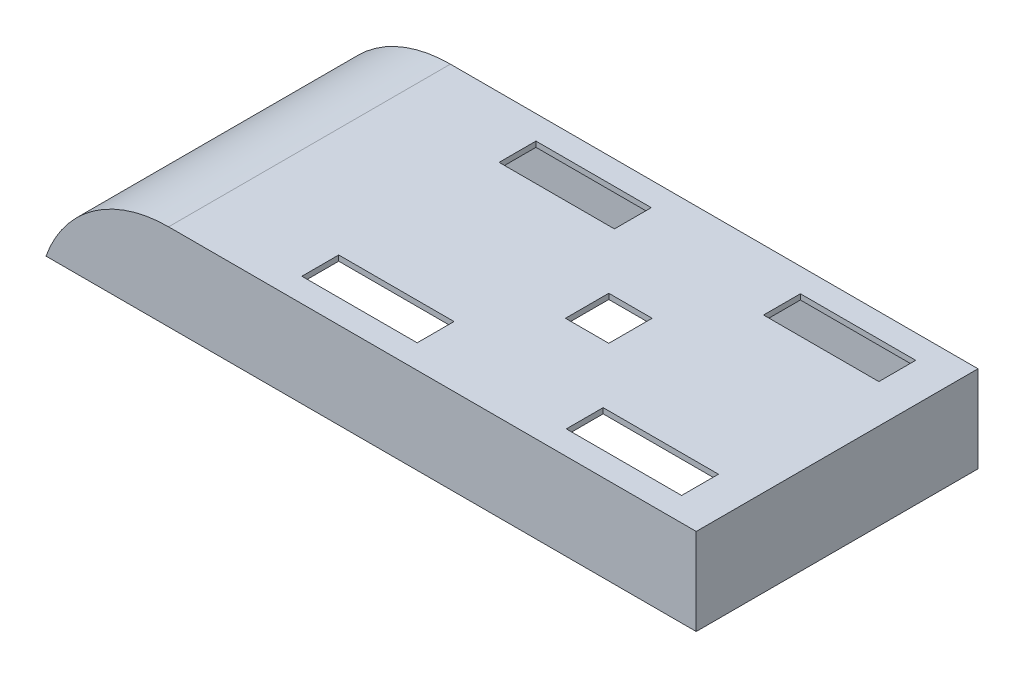
ISO-10303-21;
HEADER;
FILE_DESCRIPTION(('STEP AP214'),'2;1');
FILE_NAME('part.step','',(''),(''),'','','');
FILE_SCHEMA(('AUTOMOTIVE_DESIGN { 1 0 10303 214 1 1 1 1 }'));
ENDSEC;
DATA;
#1=APPLICATION_CONTEXT('core data for automotive mechanical design processes');
#2=APPLICATION_PROTOCOL_DEFINITION('international standard','automotive_design',2000,#1);
#3=PRODUCT_CONTEXT('',#1,'mechanical');
#4=PRODUCT('Part','Part','',(#3));
#5=PRODUCT_RELATED_PRODUCT_CATEGORY('part','',(#4));
#6=PRODUCT_DEFINITION_FORMATION('','',#4);
#7=PRODUCT_DEFINITION_CONTEXT('part definition',#1,'design');
#8=PRODUCT_DEFINITION('design','',#6,#7);
#9=PRODUCT_DEFINITION_SHAPE('','',#8);
#10=(LENGTH_UNIT() NAMED_UNIT(*) SI_UNIT(.MILLI.,.METRE.));
#11=(NAMED_UNIT(*) PLANE_ANGLE_UNIT() SI_UNIT($,.RADIAN.));
#12=(NAMED_UNIT(*) SI_UNIT($,.STERADIAN.) SOLID_ANGLE_UNIT());
#13=UNCERTAINTY_MEASURE_WITH_UNIT(LENGTH_MEASURE(1.E-05),#10,'distance_accuracy_value','');
#14=(GEOMETRIC_REPRESENTATION_CONTEXT(3) GLOBAL_UNCERTAINTY_ASSIGNED_CONTEXT((#13)) GLOBAL_UNIT_ASSIGNED_CONTEXT((#10,
#11,#12)) REPRESENTATION_CONTEXT('',''));
#15=CARTESIAN_POINT('',(0.,0.,0.));
#16=DIRECTION('',(0.,0.,1.));
#17=DIRECTION('',(1.,0.,0.));
#18=AXIS2_PLACEMENT_3D('',#15,#16,#17);
#19=CARTESIAN_POINT('',(0.,0.,0.));
#20=DIRECTION('',(0.,-1.,0.));
#21=DIRECTION('',(0.,0.,-1.));
#22=AXIS2_PLACEMENT_3D('',#19,#20,#21);
#23=PLANE('',#22);
#24=DIRECTION('',(0.,0.,1.));
#25=VECTOR('',#24,1.);
#26=CARTESIAN_POINT('',(0.,0.,0.));
#27=LINE('',#26,#25);
#28=CARTESIAN_POINT('',(0.,0.,-330.2));
#29=VERTEX_POINT('',#28);
#30=CARTESIAN_POINT('',(0.,0.,0.));
#31=VERTEX_POINT('',#30);
#32=EDGE_CURVE('E355',#29,#31,#27,.T.);
#33=ORIENTED_EDGE('',*,*,#32,.F.);
#34=DIRECTION('',(-1.,0.,0.));
#35=VECTOR('',#34,1.);
#36=CARTESIAN_POINT('',(0.,0.,-330.2));
#37=LINE('',#36,#35);
#38=CARTESIAN_POINT('',(762.,0.,-330.2));
#39=VERTEX_POINT('',#38);
#40=EDGE_CURVE('E373',#39,#29,#37,.T.);
#41=ORIENTED_EDGE('',*,*,#40,.F.);
#42=DIRECTION('',(0.,0.,-1.));
#43=VECTOR('',#42,1.);
#44=CARTESIAN_POINT('',(762.,0.,0.));
#45=LINE('',#44,#43);
#46=CARTESIAN_POINT('',(762.,0.,0.));
#47=VERTEX_POINT('',#46);
#48=EDGE_CURVE('E383',#47,#39,#45,.T.);
#49=ORIENTED_EDGE('',*,*,#48,.F.);
#50=DIRECTION('',(1.,0.,0.));
#51=VECTOR('',#50,1.);
#52=CARTESIAN_POINT('',(0.,0.,0.));
#53=LINE('',#52,#51);
#54=EDGE_CURVE('E381',#31,#47,#53,.T.);
#55=ORIENTED_EDGE('',*,*,#54,.F.);
#56=EDGE_LOOP('',(#33,#41,#49,#55));
#57=FACE_BOUND('',#56,.T.);
#58=DIRECTION('',(-1.,0.,0.));
#59=VECTOR('',#58,1.);
#60=CARTESIAN_POINT('',(0.,0.,-323.85));
#61=LINE('',#60,#59);
#62=CARTESIAN_POINT('',(755.65,0.,-323.85));
#63=VERTEX_POINT('',#62);
#64=CARTESIAN_POINT('',(6.75359549152275,0.,-323.85));
#65=VERTEX_POINT('',#64);
#66=EDGE_CURVE('E342',#63,#65,#61,.T.);
#67=ORIENTED_EDGE('',*,*,#66,.T.);
#68=DIRECTION('',(0.,0.,-1.));
#69=VECTOR('',#68,1.);
#70=CARTESIAN_POINT('',(6.75359549152275,0.,-323.85));
#71=LINE('',#70,#69);
#72=CARTESIAN_POINT('',(6.75359549152275,0.,-6.35));
#73=VERTEX_POINT('',#72);
#74=EDGE_CURVE('E332',#65,#73,#71,.F.);
#75=ORIENTED_EDGE('',*,*,#74,.T.);
#76=DIRECTION('',(1.,0.,0.));
#77=VECTOR('',#76,1.);
#78=CARTESIAN_POINT('',(0.,0.,-6.35));
#79=LINE('',#78,#77);
#80=CARTESIAN_POINT('',(755.65,0.,-6.35));
#81=VERTEX_POINT('',#80);
#82=EDGE_CURVE('E360',#73,#81,#79,.T.);
#83=ORIENTED_EDGE('',*,*,#82,.T.);
#84=DIRECTION('',(0.,0.,-1.));
#85=VECTOR('',#84,1.);
#86=CARTESIAN_POINT('',(755.65,0.,0.));
#87=LINE('',#86,#85);
#88=EDGE_CURVE('E363',#81,#63,#87,.T.);
#89=ORIENTED_EDGE('',*,*,#88,.T.);
#90=EDGE_LOOP('',(#67,#75,#83,#89));
#91=FACE_BOUND('',#90,.T.);
#92=ADVANCED_FACE('F45',(#57,#91),#23,.T.);
#93=CARTESIAN_POINT('',(0.,101.6,0.));
#94=DIRECTION('',(0.,0.,-1.));
#95=DIRECTION('',(-1.,0.,0.));
#96=AXIS2_PLACEMENT_3D('',#93,#94,#95);
#97=PLANE('',#96);
#98=DIRECTION('',(1.,0.,0.));
#99=VECTOR('',#98,1.);
#100=CARTESIAN_POINT('',(0.,101.6,0.));
#101=LINE('',#100,#99);
#102=CARTESIAN_POINT('',(143.684097937106,101.6,0.));
#103=VERTEX_POINT('',#102);
#104=CARTESIAN_POINT('',(762.,101.6,0.));
#105=VERTEX_POINT('',#104);
#106=EDGE_CURVE('E370',#103,#105,#101,.T.);
#107=ORIENTED_EDGE('',*,*,#106,.F.);
#108=CARTESIAN_POINT('',(143.684097937106,-50.7999999999999,0.));
#109=DIRECTION('',(0.,0.,-1.));
#110=DIRECTION('',(-1.,0.,0.));
#111=AXIS2_PLACEMENT_3D('',#108,#109,#110);
#112=CIRCLE('',#111,152.4);
#113=EDGE_CURVE('E394',#103,#31,#112,.F.);
#114=ORIENTED_EDGE('',*,*,#113,.T.);
#115=ORIENTED_EDGE('',*,*,#54,.T.);
#116=DIRECTION('',(0.,-1.,0.));
#117=VECTOR('',#116,1.);
#118=CARTESIAN_POINT('',(762.,101.6,0.));
#119=LINE('',#118,#117);
#120=EDGE_CURVE('E388',#105,#47,#119,.T.);
#121=ORIENTED_EDGE('',*,*,#120,.F.);
#122=EDGE_LOOP('',(#107,#114,#115,#121));
#123=FACE_BOUND('',#122,.T.);
#124=ADVANCED_FACE('F495',(#123),#97,.F.);
#125=CARTESIAN_POINT('',(762.,101.6,0.));
#126=DIRECTION('',(-1.,0.,0.));
#127=DIRECTION('',(0.,0.,1.));
#128=AXIS2_PLACEMENT_3D('',#125,#126,#127);
#129=PLANE('',#128);
#130=ORIENTED_EDGE('',*,*,#48,.T.);
#131=DIRECTION('',(0.,-1.,0.));
#132=VECTOR('',#131,1.);
#133=CARTESIAN_POINT('',(762.,101.6,-330.2));
#134=LINE('',#133,#132);
#135=CARTESIAN_POINT('',(762.,101.6,-330.2));
#136=VERTEX_POINT('',#135);
#137=EDGE_CURVE('E378',#136,#39,#134,.T.);
#138=ORIENTED_EDGE('',*,*,#137,.F.);
#139=DIRECTION('',(0.,0.,-1.));
#140=VECTOR('',#139,1.);
#141=CARTESIAN_POINT('',(762.,101.6,0.));
#142=LINE('',#141,#140);
#143=EDGE_CURVE('E372',#105,#136,#142,.T.);
#144=ORIENTED_EDGE('',*,*,#143,.F.);
#145=ORIENTED_EDGE('',*,*,#120,.T.);
#146=EDGE_LOOP('',(#130,#138,#144,#145));
#147=FACE_BOUND('',#146,.T.);
#148=ADVANCED_FACE('F503',(#147),#129,.F.);
#149=CARTESIAN_POINT('',(0.,101.6,-330.2));
#150=DIRECTION('',(0.,0.,1.));
#151=DIRECTION('',(1.,0.,0.));
#152=AXIS2_PLACEMENT_3D('',#149,#150,#151);
#153=PLANE('',#152);
#154=ORIENTED_EDGE('',*,*,#40,.T.);
#155=CARTESIAN_POINT('',(143.684097937106,-50.7999999999999,-330.2));
#156=DIRECTION('',(0.,0.,1.));
#157=DIRECTION('',(1.,0.,0.));
#158=AXIS2_PLACEMENT_3D('',#155,#156,#157);
#159=CIRCLE('',#158,152.4);
#160=CARTESIAN_POINT('',(143.684097937106,101.6,-330.2));
#161=VERTEX_POINT('',#160);
#162=EDGE_CURVE('E396',#29,#161,#159,.F.);
#163=ORIENTED_EDGE('',*,*,#162,.T.);
#164=DIRECTION('',(-1.,0.,0.));
#165=VECTOR('',#164,1.);
#166=CARTESIAN_POINT('',(0.,101.6,-330.2));
#167=LINE('',#166,#165);
#168=EDGE_CURVE('E375',#136,#161,#167,.T.);
#169=ORIENTED_EDGE('',*,*,#168,.F.);
#170=ORIENTED_EDGE('',*,*,#137,.T.);
#171=EDGE_LOOP('',(#154,#163,#169,#170));
#172=FACE_BOUND('',#171,.T.);
#173=ADVANCED_FACE('F459',(#172),#153,.F.);
#174=CARTESIAN_POINT('',(0.,101.6,0.));
#175=DIRECTION('',(0.,-1.,0.));
#176=DIRECTION('',(0.,0.,-1.));
#177=AXIS2_PLACEMENT_3D('',#174,#175,#176);
#178=PLANE('',#177);
#179=DIRECTION('',(0.,0.,-1.));
#180=VECTOR('',#179,1.);
#181=CARTESIAN_POINT('',(716.929069023888,101.6,-27.9349999999999));
#182=LINE('',#181,#180);
#183=CARTESIAN_POINT('',(716.929069023888,101.6,-27.9349999999999));
#184=VERTEX_POINT('',#183);
#185=CARTESIAN_POINT('',(716.929069023888,101.6,-71.1150000000001));
#186=VERTEX_POINT('',#185);
#187=EDGE_CURVE('E317',#184,#186,#182,.T.);
#188=ORIENTED_EDGE('',*,*,#187,.F.);
#189=DIRECTION('',(1.,0.,0.));
#190=VECTOR('',#189,1.);
#191=CARTESIAN_POINT('',(716.929069023888,101.6,-27.9349999999999));
#192=LINE('',#191,#190);
#193=CARTESIAN_POINT('',(581.801069023888,101.6,-27.9349999999998));
#194=VERTEX_POINT('',#193);
#195=EDGE_CURVE('E60',#194,#184,#192,.T.);
#196=ORIENTED_EDGE('',*,*,#195,.F.);
#197=DIRECTION('',(0.,0.,1.));
#198=VECTOR('',#197,1.);
#199=CARTESIAN_POINT('',(581.801069023888,101.6,-27.9349999999998));
#200=LINE('',#199,#198);
#201=CARTESIAN_POINT('',(581.801069023888,101.6,-71.1150000000002));
#202=VERTEX_POINT('',#201);
#203=EDGE_CURVE('E305',#202,#194,#200,.T.);
#204=ORIENTED_EDGE('',*,*,#203,.F.);
#205=DIRECTION('',(-1.,0.,0.));
#206=VECTOR('',#205,1.);
#207=CARTESIAN_POINT('',(716.929069023888,101.6,-71.1150000000001));
#208=LINE('',#207,#206);
#209=EDGE_CURVE('E314',#186,#202,#208,.T.);
#210=ORIENTED_EDGE('',*,*,#209,.F.);
#211=EDGE_LOOP('',(#188,#196,#204,#210));
#212=FACE_BOUND('',#211,.T.);
#213=DIRECTION('',(-1.,0.,0.));
#214=VECTOR('',#213,1.);
#215=CARTESIAN_POINT('',(716.929069023888,101.6,-302.265));
#216=LINE('',#215,#214);
#217=CARTESIAN_POINT('',(716.929069023888,101.6,-302.265));
#218=VERTEX_POINT('',#217);
#219=CARTESIAN_POINT('',(581.801069023888,101.6,-302.265));
#220=VERTEX_POINT('',#219);
#221=EDGE_CURVE('E299',#218,#220,#216,.T.);
#222=ORIENTED_EDGE('',*,*,#221,.F.);
#223=DIRECTION('',(0.,0.,-1.));
#224=VECTOR('',#223,1.);
#225=CARTESIAN_POINT('',(716.929069023888,101.6,-302.265));
#226=LINE('',#225,#224);
#227=CARTESIAN_POINT('',(716.929069023888,101.6,-259.085));
#228=VERTEX_POINT('',#227);
#229=EDGE_CURVE('E68',#228,#218,#226,.T.);
#230=ORIENTED_EDGE('',*,*,#229,.F.);
#231=DIRECTION('',(1.,0.,0.));
#232=VECTOR('',#231,1.);
#233=CARTESIAN_POINT('',(716.929069023888,101.6,-259.085));
#234=LINE('',#233,#232);
#235=CARTESIAN_POINT('',(581.801069023888,101.6,-259.085));
#236=VERTEX_POINT('',#235);
#237=EDGE_CURVE('E287',#236,#228,#234,.T.);
#238=ORIENTED_EDGE('',*,*,#237,.F.);
#239=DIRECTION('',(0.,0.,1.));
#240=VECTOR('',#239,1.);
#241=CARTESIAN_POINT('',(581.801069023888,101.6,-302.265));
#242=LINE('',#241,#240);
#243=EDGE_CURVE('E296',#220,#236,#242,.T.);
#244=ORIENTED_EDGE('',*,*,#243,.F.);
#245=EDGE_LOOP('',(#222,#230,#238,#244));
#246=FACE_BOUND('',#245,.T.);
#247=DIRECTION('',(-1.,0.,0.));
#248=VECTOR('',#247,1.);
#249=CARTESIAN_POINT('',(469.025069023888,101.6,-190.5));
#250=LINE('',#249,#248);
#251=CARTESIAN_POINT('',(519.825069023888,101.6,-190.5));
#252=VERTEX_POINT('',#251);
#253=CARTESIAN_POINT('',(469.025069023888,101.6,-190.5));
#254=VERTEX_POINT('',#253);
#255=EDGE_CURVE('E281',#252,#254,#250,.T.);
#256=ORIENTED_EDGE('',*,*,#255,.F.);
#257=DIRECTION('',(0.,0.,-1.));
#258=VECTOR('',#257,1.);
#259=CARTESIAN_POINT('',(519.825069023888,101.6,-139.7));
#260=LINE('',#259,#258);
#261=CARTESIAN_POINT('',(519.825069023888,101.6,-139.7));
#262=VERTEX_POINT('',#261);
#263=EDGE_CURVE('E242',#262,#252,#260,.T.);
#264=ORIENTED_EDGE('',*,*,#263,.F.);
#265=DIRECTION('',(1.,0.,0.));
#266=VECTOR('',#265,1.);
#267=CARTESIAN_POINT('',(469.025069023888,101.6,-139.7));
#268=LINE('',#267,#266);
#269=CARTESIAN_POINT('',(469.025069023888,101.6,-139.7));
#270=VERTEX_POINT('',#269);
#271=EDGE_CURVE('E269',#270,#262,#268,.T.);
#272=ORIENTED_EDGE('',*,*,#271,.F.);
#273=DIRECTION('',(0.,0.,1.));
#274=VECTOR('',#273,1.);
#275=CARTESIAN_POINT('',(469.025069023888,101.6,-139.7));
#276=LINE('',#275,#274);
#277=EDGE_CURVE('E278',#254,#270,#276,.T.);
#278=ORIENTED_EDGE('',*,*,#277,.F.);
#279=EDGE_LOOP('',(#256,#264,#272,#278));
#280=FACE_BOUND('',#279,.T.);
#281=DIRECTION('',(0.,0.,1.));
#282=VECTOR('',#281,1.);
#283=CARTESIAN_POINT('',(271.921069023888,101.6,-302.265));
#284=LINE('',#283,#282);
#285=CARTESIAN_POINT('',(271.921069023888,101.6,-302.265));
#286=VERTEX_POINT('',#285);
#287=CARTESIAN_POINT('',(271.921069023888,101.6,-259.085));
#288=VERTEX_POINT('',#287);
#289=EDGE_CURVE('E258',#286,#288,#284,.T.);
#290=ORIENTED_EDGE('',*,*,#289,.F.);
#291=DIRECTION('',(-1.,0.,0.));
#292=VECTOR('',#291,1.);
#293=CARTESIAN_POINT('',(271.921069023888,101.6,-302.265));
#294=LINE('',#293,#292);
#295=CARTESIAN_POINT('',(407.049069023888,101.6,-302.265));
#296=VERTEX_POINT('',#295);
#297=EDGE_CURVE('E235',#296,#286,#294,.T.);
#298=ORIENTED_EDGE('',*,*,#297,.F.);
#299=DIRECTION('',(0.,0.,-1.));
#300=VECTOR('',#299,1.);
#301=CARTESIAN_POINT('',(407.049069023888,101.6,-302.265));
#302=LINE('',#301,#300);
#303=CARTESIAN_POINT('',(407.049069023888,101.6,-259.085));
#304=VERTEX_POINT('',#303);
#305=EDGE_CURVE('E245',#304,#296,#302,.T.);
#306=ORIENTED_EDGE('',*,*,#305,.F.);
#307=DIRECTION('',(1.,0.,0.));
#308=VECTOR('',#307,1.);
#309=CARTESIAN_POINT('',(271.921069023888,101.6,-259.085));
#310=LINE('',#309,#308);
#311=EDGE_CURVE('E251',#288,#304,#310,.T.);
#312=ORIENTED_EDGE('',*,*,#311,.F.);
#313=EDGE_LOOP('',(#290,#298,#306,#312));
#314=FACE_BOUND('',#313,.T.);
#315=DIRECTION('',(1.,0.,0.));
#316=VECTOR('',#315,1.);
#317=CARTESIAN_POINT('',(271.921069023888,101.6,-27.9349999999999));
#318=LINE('',#317,#316);
#319=CARTESIAN_POINT('',(271.921069023888,101.6,-27.9349999999999));
#320=VERTEX_POINT('',#319);
#321=CARTESIAN_POINT('',(407.049069023888,101.6,-27.9349999999998));
#322=VERTEX_POINT('',#321);
#323=EDGE_CURVE('E261',#320,#322,#318,.T.);
#324=ORIENTED_EDGE('',*,*,#323,.F.);
#325=DIRECTION('',(0.,0.,1.));
#326=VECTOR('',#325,1.);
#327=CARTESIAN_POINT('',(271.921069023888,101.6,-27.9349999999999));
#328=LINE('',#327,#326);
#329=CARTESIAN_POINT('',(271.921069023888,101.6,-71.115));
#330=VERTEX_POINT('',#329);
#331=EDGE_CURVE('E259',#330,#320,#328,.T.);
#332=ORIENTED_EDGE('',*,*,#331,.F.);
#333=DIRECTION('',(-1.,0.,0.));
#334=VECTOR('',#333,1.);
#335=CARTESIAN_POINT('',(271.921069023888,101.6,-71.115));
#336=LINE('',#335,#334);
#337=CARTESIAN_POINT('',(407.049069023888,101.6,-71.1150000000001));
#338=VERTEX_POINT('',#337);
#339=EDGE_CURVE('E326',#338,#330,#336,.T.);
#340=ORIENTED_EDGE('',*,*,#339,.F.);
#341=DIRECTION('',(0.,0.,-1.));
#342=VECTOR('',#341,1.);
#343=CARTESIAN_POINT('',(407.049069023888,101.6,-27.9349999999998));
#344=LINE('',#343,#342);
#345=EDGE_CURVE('E323',#322,#338,#344,.T.);
#346=ORIENTED_EDGE('',*,*,#345,.F.);
#347=EDGE_LOOP('',(#324,#332,#340,#346));
#348=FACE_BOUND('',#347,.T.);
#349=ORIENTED_EDGE('',*,*,#168,.T.);
#350=DIRECTION('',(0.,0.,-1.));
#351=VECTOR('',#350,1.);
#352=CARTESIAN_POINT('',(143.684097937106,101.6,0.));
#353=LINE('',#352,#351);
#354=EDGE_CURVE('E391',#161,#103,#353,.F.);
#355=ORIENTED_EDGE('',*,*,#354,.T.);
#356=ORIENTED_EDGE('',*,*,#106,.T.);
#357=ORIENTED_EDGE('',*,*,#143,.T.);
#358=EDGE_LOOP('',(#349,#355,#356,#357));
#359=FACE_BOUND('',#358,.T.);
#360=ADVANCED_FACE('F255',(#212,#246,#280,#314,#348,#359),#178,.F.);
#361=CARTESIAN_POINT('',(143.684097937106,-50.7999999999999,0.));
#362=DIRECTION('',(0.,0.,-1.));
#363=DIRECTION('',(-1.,0.,0.));
#364=AXIS2_PLACEMENT_3D('',#361,#362,#363);
#365=CYLINDRICAL_SURFACE('',#364,152.4);
#366=ORIENTED_EDGE('',*,*,#162,.F.);
#367=ORIENTED_EDGE('',*,*,#32,.T.);
#368=ORIENTED_EDGE('',*,*,#113,.F.);
#369=ORIENTED_EDGE('',*,*,#354,.F.);
#370=EDGE_LOOP('',(#366,#367,#368,#369));
#371=FACE_BOUND('',#370,.T.);
#372=ADVANCED_FACE('F47',(#371),#365,.T.);
#373=CARTESIAN_POINT('',(0.,101.6,-6.35));
#374=DIRECTION('',(0.,0.,-1.));
#375=DIRECTION('',(-1.,0.,0.));
#376=AXIS2_PLACEMENT_3D('',#373,#374,#375);
#377=PLANE('',#376);
#378=DIRECTION('',(1.,0.,0.));
#379=VECTOR('',#378,1.);
#380=CARTESIAN_POINT('',(0.,95.25,-6.35));
#381=LINE('',#380,#379);
#382=CARTESIAN_POINT('',(143.684097937106,95.25,-6.35));
#383=VERTEX_POINT('',#382);
#384=CARTESIAN_POINT('',(755.65,95.25,-6.35));
#385=VERTEX_POINT('',#384);
#386=EDGE_CURVE('E339',#383,#385,#381,.T.);
#387=ORIENTED_EDGE('',*,*,#386,.T.);
#388=DIRECTION('',(0.,-1.,0.));
#389=VECTOR('',#388,1.);
#390=CARTESIAN_POINT('',(755.65,101.6,-6.35));
#391=LINE('',#390,#389);
#392=EDGE_CURVE('E347',#385,#81,#391,.T.);
#393=ORIENTED_EDGE('',*,*,#392,.T.);
#394=ORIENTED_EDGE('',*,*,#82,.F.);
#395=CARTESIAN_POINT('',(143.684097937106,-50.7999999999999,-6.35));
#396=DIRECTION('',(0.,0.,-1.));
#397=DIRECTION('',(-1.,0.,0.));
#398=AXIS2_PLACEMENT_3D('',#395,#396,#397);
#399=CIRCLE('',#398,146.05);
#400=EDGE_CURVE('E343',#383,#73,#399,.F.);
#401=ORIENTED_EDGE('',*,*,#400,.F.);
#402=EDGE_LOOP('',(#387,#393,#394,#401));
#403=FACE_BOUND('',#402,.T.);
#404=ADVANCED_FACE('F529',(#403),#377,.T.);
#405=CARTESIAN_POINT('',(755.65,101.6,0.));
#406=DIRECTION('',(-1.,0.,0.));
#407=DIRECTION('',(0.,0.,1.));
#408=AXIS2_PLACEMENT_3D('',#405,#406,#407);
#409=PLANE('',#408);
#410=ORIENTED_EDGE('',*,*,#88,.F.);
#411=ORIENTED_EDGE('',*,*,#392,.F.);
#412=DIRECTION('',(0.,0.,-1.));
#413=VECTOR('',#412,1.);
#414=CARTESIAN_POINT('',(755.65,95.25,0.));
#415=LINE('',#414,#413);
#416=CARTESIAN_POINT('',(755.65,95.25,-323.85));
#417=VERTEX_POINT('',#416);
#418=EDGE_CURVE('E341',#385,#417,#415,.T.);
#419=ORIENTED_EDGE('',*,*,#418,.T.);
#420=DIRECTION('',(0.,-1.,0.));
#421=VECTOR('',#420,1.);
#422=CARTESIAN_POINT('',(755.65,101.6,-323.85));
#423=LINE('',#422,#421);
#424=EDGE_CURVE('E350',#417,#63,#423,.T.);
#425=ORIENTED_EDGE('',*,*,#424,.T.);
#426=EDGE_LOOP('',(#410,#411,#419,#425));
#427=FACE_BOUND('',#426,.T.);
#428=ADVANCED_FACE('F533',(#427),#409,.T.);
#429=CARTESIAN_POINT('',(0.,101.6,-323.85));
#430=DIRECTION('',(0.,0.,1.));
#431=DIRECTION('',(1.,0.,0.));
#432=AXIS2_PLACEMENT_3D('',#429,#430,#431);
#433=PLANE('',#432);
#434=ORIENTED_EDGE('',*,*,#66,.F.);
#435=ORIENTED_EDGE('',*,*,#424,.F.);
#436=DIRECTION('',(-1.,0.,0.));
#437=VECTOR('',#436,1.);
#438=CARTESIAN_POINT('',(0.,95.25,-323.85));
#439=LINE('',#438,#437);
#440=CARTESIAN_POINT('',(143.684097937106,95.25,-323.85));
#441=VERTEX_POINT('',#440);
#442=EDGE_CURVE('E352',#417,#441,#439,.T.);
#443=ORIENTED_EDGE('',*,*,#442,.T.);
#444=CARTESIAN_POINT('',(143.684097937106,-50.7999999999999,-323.85));
#445=DIRECTION('',(0.,0.,1.));
#446=DIRECTION('',(1.,0.,0.));
#447=AXIS2_PLACEMENT_3D('',#444,#445,#446);
#448=CIRCLE('',#447,146.05);
#449=EDGE_CURVE('E345',#65,#441,#448,.F.);
#450=ORIENTED_EDGE('',*,*,#449,.F.);
#451=EDGE_LOOP('',(#434,#435,#443,#450));
#452=FACE_BOUND('',#451,.T.);
#453=ADVANCED_FACE('F539',(#452),#433,.T.);
#454=CARTESIAN_POINT('',(0.,95.25,0.));
#455=DIRECTION('',(0.,-1.,0.));
#456=DIRECTION('',(0.,0.,-1.));
#457=AXIS2_PLACEMENT_3D('',#454,#455,#456);
#458=PLANE('',#457);
#459=DIRECTION('',(-1.,0.,0.));
#460=VECTOR('',#459,1.);
#461=CARTESIAN_POINT('',(0.,95.25,-27.9349999999997));
#462=LINE('',#461,#460);
#463=CARTESIAN_POINT('',(716.929069023888,95.25,-27.9349999999999));
#464=VERTEX_POINT('',#463);
#465=CARTESIAN_POINT('',(581.801069023888,95.25,-27.9349999999998));
#466=VERTEX_POINT('',#465);
#467=EDGE_CURVE('E11',#464,#466,#462,.T.);
#468=ORIENTED_EDGE('',*,*,#467,.F.);
#469=DIRECTION('',(0.,0.,1.));
#470=VECTOR('',#469,1.);
#471=CARTESIAN_POINT('',(716.929069023888,95.25,-1.84333293064705E-12));
#472=LINE('',#471,#470);
#473=CARTESIAN_POINT('',(716.929069023888,95.25,-71.1150000000001));
#474=VERTEX_POINT('',#473);
#475=EDGE_CURVE('E433',#474,#464,#472,.T.);
#476=ORIENTED_EDGE('',*,*,#475,.F.);
#477=DIRECTION('',(1.,0.,0.));
#478=VECTOR('',#477,1.);
#479=CARTESIAN_POINT('',(0.,95.25,-71.1150000000004));
#480=LINE('',#479,#478);
#481=CARTESIAN_POINT('',(581.801069023888,95.25,-71.1150000000002));
#482=VERTEX_POINT('',#481);
#483=EDGE_CURVE('E435',#482,#474,#480,.T.);
#484=ORIENTED_EDGE('',*,*,#483,.F.);
#485=DIRECTION('',(0.,0.,-1.));
#486=VECTOR('',#485,1.);
#487=CARTESIAN_POINT('',(581.801069023888,95.25,0.));
#488=LINE('',#487,#486);
#489=EDGE_CURVE('E53',#466,#482,#488,.T.);
#490=ORIENTED_EDGE('',*,*,#489,.F.);
#491=EDGE_LOOP('',(#468,#476,#484,#490));
#492=FACE_BOUND('',#491,.T.);
#493=DIRECTION('',(0.,0.,1.));
#494=VECTOR('',#493,1.);
#495=CARTESIAN_POINT('',(716.929069023887,95.25,1.84333293064704E-12));
#496=LINE('',#495,#494);
#497=CARTESIAN_POINT('',(716.929069023888,95.25,-302.265));
#498=VERTEX_POINT('',#497);
#499=CARTESIAN_POINT('',(716.929069023888,95.25,-259.085));
#500=VERTEX_POINT('',#499);
#501=EDGE_CURVE('E431',#498,#500,#496,.T.);
#502=ORIENTED_EDGE('',*,*,#501,.F.);
#503=DIRECTION('',(1.,0.,0.));
#504=VECTOR('',#503,1.);
#505=CARTESIAN_POINT('',(-1.24171734406756E-13,95.25,-302.265));
#506=LINE('',#505,#504);
#507=CARTESIAN_POINT('',(581.801069023888,95.25,-302.265));
#508=VERTEX_POINT('',#507);
#509=EDGE_CURVE('E424',#508,#498,#506,.T.);
#510=ORIENTED_EDGE('',*,*,#509,.F.);
#511=DIRECTION('',(0.,0.,-1.));
#512=VECTOR('',#511,1.);
#513=CARTESIAN_POINT('',(581.801069023889,95.25,-1.49589843117612E-12));
#514=LINE('',#513,#512);
#515=CARTESIAN_POINT('',(581.801069023888,95.25,-259.085));
#516=VERTEX_POINT('',#515);
#517=EDGE_CURVE('E426',#516,#508,#514,.T.);
#518=ORIENTED_EDGE('',*,*,#517,.F.);
#519=DIRECTION('',(-1.,0.,0.));
#520=VECTOR('',#519,1.);
#521=CARTESIAN_POINT('',(-1.06433208637369E-13,95.25,-259.085));
#522=LINE('',#521,#520);
#523=EDGE_CURVE('E429',#500,#516,#522,.T.);
#524=ORIENTED_EDGE('',*,*,#523,.F.);
#525=EDGE_LOOP('',(#502,#510,#518,#524));
#526=FACE_BOUND('',#525,.T.);
#527=DIRECTION('',(0.,0.,1.));
#528=VECTOR('',#527,1.);
#529=CARTESIAN_POINT('',(519.825069023888,95.25,0.));
#530=LINE('',#529,#528);
#531=CARTESIAN_POINT('',(519.825069023888,95.25,-190.5));
#532=VERTEX_POINT('',#531);
#533=CARTESIAN_POINT('',(519.825069023888,95.25,-139.7));
#534=VERTEX_POINT('',#533);
#535=EDGE_CURVE('E422',#532,#534,#530,.T.);
#536=ORIENTED_EDGE('',*,*,#535,.F.);
#537=DIRECTION('',(1.,0.,0.));
#538=VECTOR('',#537,1.);
#539=CARTESIAN_POINT('',(0.,95.25,-190.5));
#540=LINE('',#539,#538);
#541=CARTESIAN_POINT('',(469.025069023888,95.25,-190.5));
#542=VERTEX_POINT('',#541);
#543=EDGE_CURVE('E415',#542,#532,#540,.T.);
#544=ORIENTED_EDGE('',*,*,#543,.F.);
#545=DIRECTION('',(0.,0.,-1.));
#546=VECTOR('',#545,1.);
#547=CARTESIAN_POINT('',(469.025069023888,95.25,0.));
#548=LINE('',#547,#546);
#549=CARTESIAN_POINT('',(469.025069023888,95.25,-139.7));
#550=VERTEX_POINT('',#549);
#551=EDGE_CURVE('E417',#550,#542,#548,.T.);
#552=ORIENTED_EDGE('',*,*,#551,.F.);
#553=DIRECTION('',(-1.,0.,0.));
#554=VECTOR('',#553,1.);
#555=CARTESIAN_POINT('',(0.,95.25,-139.7));
#556=LINE('',#555,#554);
#557=EDGE_CURVE('E420',#534,#550,#556,.T.);
#558=ORIENTED_EDGE('',*,*,#557,.F.);
#559=EDGE_LOOP('',(#536,#544,#552,#558));
#560=FACE_BOUND('',#559,.T.);
#561=DIRECTION('',(1.,0.,0.));
#562=VECTOR('',#561,1.);
#563=CARTESIAN_POINT('',(0.,95.25,-302.265));
#564=LINE('',#563,#562);
#565=CARTESIAN_POINT('',(271.921069023888,95.25,-302.265));
#566=VERTEX_POINT('',#565);
#567=CARTESIAN_POINT('',(407.049069023888,95.25,-302.265));
#568=VERTEX_POINT('',#567);
#569=EDGE_CURVE('E238',#566,#568,#564,.T.);
#570=ORIENTED_EDGE('',*,*,#569,.F.);
#571=DIRECTION('',(0.,0.,-1.));
#572=VECTOR('',#571,1.);
#573=CARTESIAN_POINT('',(271.921069023889,95.25,-3.49575071457858E-13));
#574=LINE('',#573,#572);
#575=CARTESIAN_POINT('',(271.921069023888,95.25,-259.085));
#576=VERTEX_POINT('',#575);
#577=EDGE_CURVE('E407',#576,#566,#574,.T.);
#578=ORIENTED_EDGE('',*,*,#577,.F.);
#579=DIRECTION('',(-1.,0.,0.));
#580=VECTOR('',#579,1.);
#581=CARTESIAN_POINT('',(0.,95.25,-259.085));
#582=LINE('',#581,#580);
#583=CARTESIAN_POINT('',(407.049069023888,95.25,-259.085));
#584=VERTEX_POINT('',#583);
#585=EDGE_CURVE('E409',#584,#576,#582,.T.);
#586=ORIENTED_EDGE('',*,*,#585,.F.);
#587=DIRECTION('',(0.,0.,1.));
#588=VECTOR('',#587,1.);
#589=CARTESIAN_POINT('',(407.049069023887,95.25,1.04658464238664E-12));
#590=LINE('',#589,#588);
#591=EDGE_CURVE('E412',#568,#584,#590,.T.);
#592=ORIENTED_EDGE('',*,*,#591,.F.);
#593=EDGE_LOOP('',(#570,#578,#586,#592));
#594=FACE_BOUND('',#593,.T.);
#595=DIRECTION('',(0.,0.,-1.));
#596=VECTOR('',#595,1.);
#597=CARTESIAN_POINT('',(271.921069023888,95.25,6.99150142915717E-13));
#598=LINE('',#597,#596);
#599=CARTESIAN_POINT('',(271.921069023888,95.25,-27.9349999999999));
#600=VERTEX_POINT('',#599);
#601=CARTESIAN_POINT('',(271.921069023888,95.25,-71.115));
#602=VERTEX_POINT('',#601);
#603=EDGE_CURVE('E405',#600,#602,#598,.T.);
#604=ORIENTED_EDGE('',*,*,#603,.F.);
#605=DIRECTION('',(-1.,0.,0.));
#606=VECTOR('',#605,1.);
#607=CARTESIAN_POINT('',(0.,95.25,-27.9350000000002));
#608=LINE('',#607,#606);
#609=CARTESIAN_POINT('',(407.049069023888,95.25,-27.9349999999998));
#610=VERTEX_POINT('',#609);
#611=EDGE_CURVE('E398',#610,#600,#608,.T.);
#612=ORIENTED_EDGE('',*,*,#611,.F.);
#613=DIRECTION('',(0.,0.,1.));
#614=VECTOR('',#613,1.);
#615=CARTESIAN_POINT('',(407.049069023888,95.25,-5.23292321193321E-13));
#616=LINE('',#615,#614);
#617=CARTESIAN_POINT('',(407.049069023888,95.25,-71.1150000000001));
#618=VERTEX_POINT('',#617);
#619=EDGE_CURVE('E400',#618,#610,#616,.T.);
#620=ORIENTED_EDGE('',*,*,#619,.F.);
#621=DIRECTION('',(1.,0.,0.));
#622=VECTOR('',#621,1.);
#623=CARTESIAN_POINT('',(0.,95.25,-71.1149999999999));
#624=LINE('',#623,#622);
#625=EDGE_CURVE('E403',#602,#618,#624,.T.);
#626=ORIENTED_EDGE('',*,*,#625,.F.);
#627=EDGE_LOOP('',(#604,#612,#620,#626));
#628=FACE_BOUND('',#627,.T.);
#629=ORIENTED_EDGE('',*,*,#442,.F.);
#630=ORIENTED_EDGE('',*,*,#418,.F.);
#631=ORIENTED_EDGE('',*,*,#386,.F.);
#632=DIRECTION('',(0.,0.,-1.));
#633=VECTOR('',#632,1.);
#634=CARTESIAN_POINT('',(143.684097937106,95.25,0.));
#635=LINE('',#634,#633);
#636=EDGE_CURVE('E346',#441,#383,#635,.F.);
#637=ORIENTED_EDGE('',*,*,#636,.F.);
#638=EDGE_LOOP('',(#629,#630,#631,#637));
#639=FACE_BOUND('',#638,.T.);
#640=ADVANCED_FACE('F450',(#492,#526,#560,#594,#628,#639),#458,.T.);
#641=CARTESIAN_POINT('',(143.684097937106,-50.7999999999999,0.));
#642=DIRECTION('',(0.,0.,-1.));
#643=DIRECTION('',(-1.,0.,0.));
#644=AXIS2_PLACEMENT_3D('',#641,#642,#643);
#645=CYLINDRICAL_SURFACE('',#644,146.05);
#646=ORIENTED_EDGE('',*,*,#449,.T.);
#647=ORIENTED_EDGE('',*,*,#636,.T.);
#648=ORIENTED_EDGE('',*,*,#400,.T.);
#649=ORIENTED_EDGE('',*,*,#74,.F.);
#650=EDGE_LOOP('',(#646,#647,#648,#649));
#651=FACE_BOUND('',#650,.T.);
#652=ADVANCED_FACE('F550',(#651),#645,.F.);
#653=CARTESIAN_POINT('',(271.921069023888,-26.162,-27.9349999999999));
#654=DIRECTION('',(-1.,0.,0.));
#655=DIRECTION('',(0.,0.,1.));
#656=AXIS2_PLACEMENT_3D('',#653,#654,#655);
#657=PLANE('',#656);
#658=ORIENTED_EDGE('',*,*,#603,.T.);
#659=DIRECTION('',(0.,1.,0.));
#660=VECTOR('',#659,1.);
#661=CARTESIAN_POINT('',(271.921069023888,-26.162,-71.115));
#662=LINE('',#661,#660);
#663=EDGE_CURVE('E330',#602,#330,#662,.T.);
#664=ORIENTED_EDGE('',*,*,#663,.T.);
#665=ORIENTED_EDGE('',*,*,#331,.T.);
#666=DIRECTION('',(0.,1.,0.));
#667=VECTOR('',#666,1.);
#668=CARTESIAN_POINT('',(271.921069023888,-26.162,-27.9349999999999));
#669=LINE('',#668,#667);
#670=EDGE_CURVE('E329',#600,#320,#669,.T.);
#671=ORIENTED_EDGE('',*,*,#670,.F.);
#672=EDGE_LOOP('',(#658,#664,#665,#671));
#673=FACE_BOUND('',#672,.T.);
#674=ADVANCED_FACE('F543',(#673),#657,.F.);
#675=CARTESIAN_POINT('',(271.921069023888,-26.162,-71.115));
#676=DIRECTION('',(0.,0.,-1.));
#677=DIRECTION('',(-1.,0.,0.));
#678=AXIS2_PLACEMENT_3D('',#675,#676,#677);
#679=PLANE('',#678);
#680=ORIENTED_EDGE('',*,*,#625,.T.);
#681=DIRECTION('',(0.,1.,0.));
#682=VECTOR('',#681,1.);
#683=CARTESIAN_POINT('',(407.049069023888,-26.162,-71.1150000000001));
#684=LINE('',#683,#682);
#685=EDGE_CURVE('E333',#618,#338,#684,.T.);
#686=ORIENTED_EDGE('',*,*,#685,.T.);
#687=ORIENTED_EDGE('',*,*,#339,.T.);
#688=ORIENTED_EDGE('',*,*,#663,.F.);
#689=EDGE_LOOP('',(#680,#686,#687,#688));
#690=FACE_BOUND('',#689,.T.);
#691=ADVANCED_FACE('F556',(#690),#679,.F.);
#692=CARTESIAN_POINT('',(407.049069023888,-26.162,-27.9349999999998));
#693=DIRECTION('',(1.,0.,0.));
#694=DIRECTION('',(0.,0.,-1.));
#695=AXIS2_PLACEMENT_3D('',#692,#693,#694);
#696=PLANE('',#695);
#697=ORIENTED_EDGE('',*,*,#619,.T.);
#698=DIRECTION('',(0.,1.,0.));
#699=VECTOR('',#698,1.);
#700=CARTESIAN_POINT('',(407.049069023888,-26.162,-27.9349999999998));
#701=LINE('',#700,#699);
#702=EDGE_CURVE('E335',#610,#322,#701,.T.);
#703=ORIENTED_EDGE('',*,*,#702,.T.);
#704=ORIENTED_EDGE('',*,*,#345,.T.);
#705=ORIENTED_EDGE('',*,*,#685,.F.);
#706=EDGE_LOOP('',(#697,#703,#704,#705));
#707=FACE_BOUND('',#706,.T.);
#708=ADVANCED_FACE('F571',(#707),#696,.F.);
#709=CARTESIAN_POINT('',(271.921069023888,-26.162,-27.9349999999999));
#710=DIRECTION('',(0.,0.,1.));
#711=DIRECTION('',(1.,0.,0.));
#712=AXIS2_PLACEMENT_3D('',#709,#710,#711);
#713=PLANE('',#712);
#714=ORIENTED_EDGE('',*,*,#611,.T.);
#715=ORIENTED_EDGE('',*,*,#670,.T.);
#716=ORIENTED_EDGE('',*,*,#323,.T.);
#717=ORIENTED_EDGE('',*,*,#702,.F.);
#718=EDGE_LOOP('',(#714,#715,#716,#717));
#719=FACE_BOUND('',#718,.T.);
#720=ADVANCED_FACE('F588',(#719),#713,.F.);
#721=CARTESIAN_POINT('',(271.921069023888,-26.162,-302.265));
#722=DIRECTION('',(0.,0.,-1.));
#723=DIRECTION('',(-1.,0.,0.));
#724=AXIS2_PLACEMENT_3D('',#721,#722,#723);
#725=PLANE('',#724);
#726=ORIENTED_EDGE('',*,*,#569,.T.);
#727=DIRECTION('',(0.,1.,0.));
#728=VECTOR('',#727,1.);
#729=CARTESIAN_POINT('',(407.049069023888,-26.162,-302.265));
#730=LINE('',#729,#728);
#731=EDGE_CURVE('E230',#568,#296,#730,.T.);
#732=ORIENTED_EDGE('',*,*,#731,.T.);
#733=ORIENTED_EDGE('',*,*,#297,.T.);
#734=DIRECTION('',(0.,1.,0.));
#735=VECTOR('',#734,1.);
#736=CARTESIAN_POINT('',(271.921069023888,-26.162,-302.265));
#737=LINE('',#736,#735);
#738=EDGE_CURVE('E252',#566,#286,#737,.T.);
#739=ORIENTED_EDGE('',*,*,#738,.F.);
#740=EDGE_LOOP('',(#726,#732,#733,#739));
#741=FACE_BOUND('',#740,.T.);
#742=ADVANCED_FACE('F232',(#741),#725,.F.);
#743=CARTESIAN_POINT('',(407.049069023888,-26.162,-302.265));
#744=DIRECTION('',(1.,0.,0.));
#745=DIRECTION('',(0.,0.,-1.));
#746=AXIS2_PLACEMENT_3D('',#743,#744,#745);
#747=PLANE('',#746);
#748=ORIENTED_EDGE('',*,*,#591,.T.);
#749=DIRECTION('',(0.,1.,0.));
#750=VECTOR('',#749,1.);
#751=CARTESIAN_POINT('',(407.049069023888,-26.162,-259.085));
#752=LINE('',#751,#750);
#753=EDGE_CURVE('E241',#584,#304,#752,.T.);
#754=ORIENTED_EDGE('',*,*,#753,.T.);
#755=ORIENTED_EDGE('',*,*,#305,.T.);
#756=ORIENTED_EDGE('',*,*,#731,.F.);
#757=EDGE_LOOP('',(#748,#754,#755,#756));
#758=FACE_BOUND('',#757,.T.);
#759=ADVANCED_FACE('F246',(#758),#747,.F.);
#760=CARTESIAN_POINT('',(271.921069023888,-26.162,-259.085));
#761=DIRECTION('',(0.,0.,1.));
#762=DIRECTION('',(1.,0.,0.));
#763=AXIS2_PLACEMENT_3D('',#760,#761,#762);
#764=PLANE('',#763);
#765=ORIENTED_EDGE('',*,*,#585,.T.);
#766=DIRECTION('',(0.,1.,0.));
#767=VECTOR('',#766,1.);
#768=CARTESIAN_POINT('',(271.921069023888,-26.162,-259.085));
#769=LINE('',#768,#767);
#770=EDGE_CURVE('E871',#576,#288,#769,.T.);
#771=ORIENTED_EDGE('',*,*,#770,.T.);
#772=ORIENTED_EDGE('',*,*,#311,.T.);
#773=ORIENTED_EDGE('',*,*,#753,.F.);
#774=EDGE_LOOP('',(#765,#771,#772,#773));
#775=FACE_BOUND('',#774,.T.);
#776=ADVANCED_FACE('F701',(#775),#764,.F.);
#777=CARTESIAN_POINT('',(271.921069023888,-26.162,-302.265));
#778=DIRECTION('',(-1.,0.,0.));
#779=DIRECTION('',(0.,0.,1.));
#780=AXIS2_PLACEMENT_3D('',#777,#778,#779);
#781=PLANE('',#780);
#782=ORIENTED_EDGE('',*,*,#577,.T.);
#783=ORIENTED_EDGE('',*,*,#738,.T.);
#784=ORIENTED_EDGE('',*,*,#289,.T.);
#785=ORIENTED_EDGE('',*,*,#770,.F.);
#786=EDGE_LOOP('',(#782,#783,#784,#785));
#787=FACE_BOUND('',#786,.T.);
#788=ADVANCED_FACE('F693',(#787),#781,.F.);
#789=CARTESIAN_POINT('',(519.825069023888,-26.162,-139.7));
#790=DIRECTION('',(1.,0.,0.));
#791=DIRECTION('',(0.,0.,-1.));
#792=AXIS2_PLACEMENT_3D('',#789,#790,#791);
#793=PLANE('',#792);
#794=ORIENTED_EDGE('',*,*,#535,.T.);
#795=DIRECTION('',(0.,1.,0.));
#796=VECTOR('',#795,1.);
#797=CARTESIAN_POINT('',(519.825069023888,-26.162,-139.7));
#798=LINE('',#797,#796);
#799=EDGE_CURVE('E274',#534,#262,#798,.T.);
#800=ORIENTED_EDGE('',*,*,#799,.T.);
#801=ORIENTED_EDGE('',*,*,#263,.T.);
#802=DIRECTION('',(0.,1.,0.));
#803=VECTOR('',#802,1.);
#804=CARTESIAN_POINT('',(519.825069023888,-26.162,-190.5));
#805=LINE('',#804,#803);
#806=EDGE_CURVE('E266',#532,#252,#805,.T.);
#807=ORIENTED_EDGE('',*,*,#806,.F.);
#808=EDGE_LOOP('',(#794,#800,#801,#807));
#809=FACE_BOUND('',#808,.T.);
#810=ADVANCED_FACE('F474',(#809),#793,.F.);
#811=CARTESIAN_POINT('',(469.025069023888,-26.162,-139.7));
#812=DIRECTION('',(0.,0.,1.));
#813=DIRECTION('',(1.,0.,0.));
#814=AXIS2_PLACEMENT_3D('',#811,#812,#813);
#815=PLANE('',#814);
#816=ORIENTED_EDGE('',*,*,#557,.T.);
#817=DIRECTION('',(0.,1.,0.));
#818=VECTOR('',#817,1.);
#819=CARTESIAN_POINT('',(469.025069023888,-26.162,-139.7));
#820=LINE('',#819,#818);
#821=EDGE_CURVE('E272',#550,#270,#820,.T.);
#822=ORIENTED_EDGE('',*,*,#821,.T.);
#823=ORIENTED_EDGE('',*,*,#271,.T.);
#824=ORIENTED_EDGE('',*,*,#799,.F.);
#825=EDGE_LOOP('',(#816,#822,#823,#824));
#826=FACE_BOUND('',#825,.T.);
#827=ADVANCED_FACE('F482',(#826),#815,.F.);
#828=CARTESIAN_POINT('',(469.025069023888,-26.162,-139.7));
#829=DIRECTION('',(-1.,0.,0.));
#830=DIRECTION('',(0.,0.,1.));
#831=AXIS2_PLACEMENT_3D('',#828,#829,#830);
#832=PLANE('',#831);
#833=ORIENTED_EDGE('',*,*,#551,.T.);
#834=DIRECTION('',(0.,1.,0.));
#835=VECTOR('',#834,1.);
#836=CARTESIAN_POINT('',(469.025069023888,-26.162,-190.5));
#837=LINE('',#836,#835);
#838=EDGE_CURVE('E270',#542,#254,#837,.T.);
#839=ORIENTED_EDGE('',*,*,#838,.T.);
#840=ORIENTED_EDGE('',*,*,#277,.T.);
#841=ORIENTED_EDGE('',*,*,#821,.F.);
#842=EDGE_LOOP('',(#833,#839,#840,#841));
#843=FACE_BOUND('',#842,.T.);
#844=ADVANCED_FACE('F484',(#843),#832,.F.);
#845=CARTESIAN_POINT('',(469.025069023888,-26.162,-190.5));
#846=DIRECTION('',(0.,0.,-1.));
#847=DIRECTION('',(-1.,0.,0.));
#848=AXIS2_PLACEMENT_3D('',#845,#846,#847);
#849=PLANE('',#848);
#850=ORIENTED_EDGE('',*,*,#543,.T.);
#851=ORIENTED_EDGE('',*,*,#806,.T.);
#852=ORIENTED_EDGE('',*,*,#255,.T.);
#853=ORIENTED_EDGE('',*,*,#838,.F.);
#854=EDGE_LOOP('',(#850,#851,#852,#853));
#855=FACE_BOUND('',#854,.T.);
#856=ADVANCED_FACE('F469',(#855),#849,.F.);
#857=CARTESIAN_POINT('',(716.929069023888,-26.162,-302.265));
#858=DIRECTION('',(1.,0.,0.));
#859=DIRECTION('',(0.,0.,-1.));
#860=AXIS2_PLACEMENT_3D('',#857,#858,#859);
#861=PLANE('',#860);
#862=ORIENTED_EDGE('',*,*,#501,.T.);
#863=DIRECTION('',(0.,1.,0.));
#864=VECTOR('',#863,1.);
#865=CARTESIAN_POINT('',(716.929069023888,-26.162,-259.085));
#866=LINE('',#865,#864);
#867=EDGE_CURVE('E292',#500,#228,#866,.T.);
#868=ORIENTED_EDGE('',*,*,#867,.T.);
#869=ORIENTED_EDGE('',*,*,#229,.T.);
#870=DIRECTION('',(0.,1.,0.));
#871=VECTOR('',#870,1.);
#872=CARTESIAN_POINT('',(716.929069023888,-26.162,-302.265));
#873=LINE('',#872,#871);
#874=EDGE_CURVE('E285',#498,#218,#873,.T.);
#875=ORIENTED_EDGE('',*,*,#874,.F.);
#876=EDGE_LOOP('',(#862,#868,#869,#875));
#877=FACE_BOUND('',#876,.T.);
#878=ADVANCED_FACE('F491',(#877),#861,.F.);
#879=CARTESIAN_POINT('',(716.929069023888,-26.162,-259.085));
#880=DIRECTION('',(0.,0.,1.));
#881=DIRECTION('',(1.,0.,0.));
#882=AXIS2_PLACEMENT_3D('',#879,#880,#881);
#883=PLANE('',#882);
#884=ORIENTED_EDGE('',*,*,#523,.T.);
#885=DIRECTION('',(0.,1.,0.));
#886=VECTOR('',#885,1.);
#887=CARTESIAN_POINT('',(581.801069023888,-26.162,-259.085));
#888=LINE('',#887,#886);
#889=EDGE_CURVE('E290',#516,#236,#888,.T.);
#890=ORIENTED_EDGE('',*,*,#889,.T.);
#891=ORIENTED_EDGE('',*,*,#237,.T.);
#892=ORIENTED_EDGE('',*,*,#867,.F.);
#893=EDGE_LOOP('',(#884,#890,#891,#892));
#894=FACE_BOUND('',#893,.T.);
#895=ADVANCED_FACE('F606',(#894),#883,.F.);
#896=CARTESIAN_POINT('',(581.801069023888,-26.162,-302.265));
#897=DIRECTION('',(-1.,0.,0.));
#898=DIRECTION('',(0.,0.,1.));
#899=AXIS2_PLACEMENT_3D('',#896,#897,#898);
#900=PLANE('',#899);
#901=ORIENTED_EDGE('',*,*,#517,.T.);
#902=DIRECTION('',(0.,1.,0.));
#903=VECTOR('',#902,1.);
#904=CARTESIAN_POINT('',(581.801069023888,-26.162,-302.265));
#905=LINE('',#904,#903);
#906=EDGE_CURVE('E288',#508,#220,#905,.T.);
#907=ORIENTED_EDGE('',*,*,#906,.T.);
#908=ORIENTED_EDGE('',*,*,#243,.T.);
#909=ORIENTED_EDGE('',*,*,#889,.F.);
#910=EDGE_LOOP('',(#901,#907,#908,#909));
#911=FACE_BOUND('',#910,.T.);
#912=ADVANCED_FACE('F609',(#911),#900,.F.);
#913=CARTESIAN_POINT('',(716.929069023888,-26.162,-302.265));
#914=DIRECTION('',(0.,0.,-1.));
#915=DIRECTION('',(-1.,0.,0.));
#916=AXIS2_PLACEMENT_3D('',#913,#914,#915);
#917=PLANE('',#916);
#918=ORIENTED_EDGE('',*,*,#509,.T.);
#919=ORIENTED_EDGE('',*,*,#874,.T.);
#920=ORIENTED_EDGE('',*,*,#221,.T.);
#921=ORIENTED_EDGE('',*,*,#906,.F.);
#922=EDGE_LOOP('',(#918,#919,#920,#921));
#923=FACE_BOUND('',#922,.T.);
#924=ADVANCED_FACE('F605',(#923),#917,.F.);
#925=CARTESIAN_POINT('',(716.929069023888,-26.162,-27.9349999999999));
#926=DIRECTION('',(0.,0.,1.));
#927=DIRECTION('',(1.,0.,0.));
#928=AXIS2_PLACEMENT_3D('',#925,#926,#927);
#929=PLANE('',#928);
#930=ORIENTED_EDGE('',*,*,#467,.T.);
#931=DIRECTION('',(0.,1.,0.));
#932=VECTOR('',#931,1.);
#933=CARTESIAN_POINT('',(581.801069023888,-26.162,-27.9349999999998));
#934=LINE('',#933,#932);
#935=EDGE_CURVE('E310',#466,#194,#934,.T.);
#936=ORIENTED_EDGE('',*,*,#935,.T.);
#937=ORIENTED_EDGE('',*,*,#195,.T.);
#938=DIRECTION('',(0.,1.,0.));
#939=VECTOR('',#938,1.);
#940=CARTESIAN_POINT('',(716.929069023888,-26.162,-27.9349999999999));
#941=LINE('',#940,#939);
#942=EDGE_CURVE('E303',#464,#184,#941,.T.);
#943=ORIENTED_EDGE('',*,*,#942,.F.);
#944=EDGE_LOOP('',(#930,#936,#937,#943));
#945=FACE_BOUND('',#944,.T.);
#946=ADVANCED_FACE('F455',(#945),#929,.F.);
#947=CARTESIAN_POINT('',(581.801069023888,-26.162,-27.9349999999998));
#948=DIRECTION('',(-1.,0.,0.));
#949=DIRECTION('',(0.,0.,1.));
#950=AXIS2_PLACEMENT_3D('',#947,#948,#949);
#951=PLANE('',#950);
#952=ORIENTED_EDGE('',*,*,#489,.T.);
#953=DIRECTION('',(0.,1.,0.));
#954=VECTOR('',#953,1.);
#955=CARTESIAN_POINT('',(581.801069023888,-26.162,-71.1150000000002));
#956=LINE('',#955,#954);
#957=EDGE_CURVE('E308',#482,#202,#956,.T.);
#958=ORIENTED_EDGE('',*,*,#957,.T.);
#959=ORIENTED_EDGE('',*,*,#203,.T.);
#960=ORIENTED_EDGE('',*,*,#935,.F.);
#961=EDGE_LOOP('',(#952,#958,#959,#960));
#962=FACE_BOUND('',#961,.T.);
#963=ADVANCED_FACE('F441',(#962),#951,.F.);
#964=CARTESIAN_POINT('',(716.929069023888,-26.162,-71.1150000000001));
#965=DIRECTION('',(0.,0.,-1.));
#966=DIRECTION('',(-1.,0.,0.));
#967=AXIS2_PLACEMENT_3D('',#964,#965,#966);
#968=PLANE('',#967);
#969=ORIENTED_EDGE('',*,*,#483,.T.);
#970=DIRECTION('',(0.,1.,0.));
#971=VECTOR('',#970,1.);
#972=CARTESIAN_POINT('',(716.929069023888,-26.162,-71.1150000000001));
#973=LINE('',#972,#971);
#974=EDGE_CURVE('E306',#474,#186,#973,.T.);
#975=ORIENTED_EDGE('',*,*,#974,.T.);
#976=ORIENTED_EDGE('',*,*,#209,.T.);
#977=ORIENTED_EDGE('',*,*,#957,.F.);
#978=EDGE_LOOP('',(#969,#975,#976,#977));
#979=FACE_BOUND('',#978,.T.);
#980=ADVANCED_FACE('F446',(#979),#968,.F.);
#981=CARTESIAN_POINT('',(716.929069023888,-26.162,-27.9349999999999));
#982=DIRECTION('',(1.,0.,0.));
#983=DIRECTION('',(0.,0.,-1.));
#984=AXIS2_PLACEMENT_3D('',#981,#982,#983);
#985=PLANE('',#984);
#986=ORIENTED_EDGE('',*,*,#475,.T.);
#987=ORIENTED_EDGE('',*,*,#942,.T.);
#988=ORIENTED_EDGE('',*,*,#187,.T.);
#989=ORIENTED_EDGE('',*,*,#974,.F.);
#990=EDGE_LOOP('',(#986,#987,#988,#989));
#991=FACE_BOUND('',#990,.T.);
#992=ADVANCED_FACE('F453',(#991),#985,.F.);
#993=CLOSED_SHELL('',(#92,#124,#148,#173,#360,#372,#404,#428,#453,#640,#652,#674,#691,#708,#720,
#742,#759,#776,#788,#810,#827,#844,#856,#878,#895,#912,#924,#946,#963,#980,#992));
#994=MANIFOLD_SOLID_BREP('B2',#993);
#995=ADVANCED_BREP_SHAPE_REPRESENTATION('',(#18,#994),#14);
#996=SHAPE_DEFINITION_REPRESENTATION(#9,#995);
ENDSEC;
END-ISO-10303-21;
